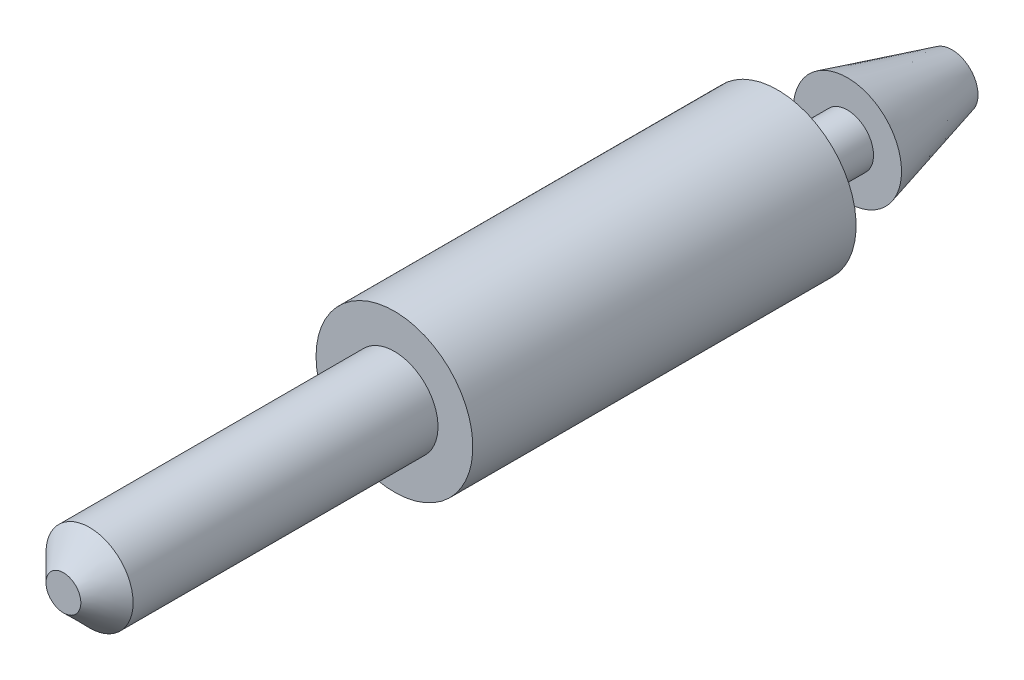
ISO-10303-21;
HEADER;
FILE_DESCRIPTION(('STEP AP214'),'2;1');
FILE_NAME('part.step','',(''),(''),'','','');
FILE_SCHEMA(('AUTOMOTIVE_DESIGN { 1 0 10303 214 1 1 1 1 }'));
ENDSEC;
DATA;
#1=APPLICATION_CONTEXT('core data for automotive mechanical design processes');
#2=APPLICATION_PROTOCOL_DEFINITION('international standard','automotive_design',2000,#1);
#3=PRODUCT_CONTEXT('',#1,'mechanical');
#4=PRODUCT('Part','Part','',(#3));
#5=PRODUCT_RELATED_PRODUCT_CATEGORY('part','',(#4));
#6=PRODUCT_DEFINITION_FORMATION('','',#4);
#7=PRODUCT_DEFINITION_CONTEXT('part definition',#1,'design');
#8=PRODUCT_DEFINITION('design','',#6,#7);
#9=PRODUCT_DEFINITION_SHAPE('','',#8);
#10=(LENGTH_UNIT() NAMED_UNIT(*) SI_UNIT(.MILLI.,.METRE.));
#11=(NAMED_UNIT(*) PLANE_ANGLE_UNIT() SI_UNIT($,.RADIAN.));
#12=(NAMED_UNIT(*) SI_UNIT($,.STERADIAN.) SOLID_ANGLE_UNIT());
#13=UNCERTAINTY_MEASURE_WITH_UNIT(LENGTH_MEASURE(1.E-05),#10,'distance_accuracy_value','');
#14=(GEOMETRIC_REPRESENTATION_CONTEXT(3) GLOBAL_UNCERTAINTY_ASSIGNED_CONTEXT((#13)) GLOBAL_UNIT_ASSIGNED_CONTEXT((#10,
#11,#12)) REPRESENTATION_CONTEXT('',''));
#15=CARTESIAN_POINT('',(0.,0.,0.));
#16=DIRECTION('',(0.,0.,1.));
#17=DIRECTION('',(1.,0.,0.));
#18=AXIS2_PLACEMENT_3D('',#15,#16,#17);
#19=CARTESIAN_POINT('',(0.,0.,0.));
#20=DIRECTION('',(0.,0.,1.));
#21=DIRECTION('',(-1.,0.,0.));
#22=AXIS2_PLACEMENT_3D('',#19,#20,#21);
#23=CONICAL_SURFACE('',#22,0.3,0.261799387799149);
#24=CARTESIAN_POINT('',(0.,0.,1.2));
#25=DIRECTION('',(0.,0.,-1.));
#26=DIRECTION('',(-1.,0.,0.));
#27=AXIS2_PLACEMENT_3D('',#24,#25,#26);
#28=CIRCLE('',#27,0.621539030917347);
#29=CARTESIAN_POINT('',(-0.621539030917347,0.,1.2));
#30=VERTEX_POINT('',#29);
#31=EDGE_CURVE('E10',#30,#30,#28,.T.);
#32=ORIENTED_EDGE('',*,*,#31,.T.);
#33=EDGE_LOOP('',(#32));
#34=FACE_BOUND('',#33,.T.);
#35=CARTESIAN_POINT('',(0.,0.,0.));
#36=DIRECTION('',(0.,0.,-1.));
#37=DIRECTION('',(-1.,0.,0.));
#38=AXIS2_PLACEMENT_3D('',#35,#36,#37);
#39=CIRCLE('',#38,0.3);
#40=CARTESIAN_POINT('',(-0.3,0.,0.));
#41=VERTEX_POINT('',#40);
#42=EDGE_CURVE('E31',#41,#41,#39,.T.);
#43=ORIENTED_EDGE('',*,*,#42,.F.);
#44=EDGE_LOOP('',(#43));
#45=FACE_BOUND('',#44,.T.);
#46=ADVANCED_FACE('F14',(#34,#45),#23,.T.);
#47=CARTESIAN_POINT('',(0.,0.,9.9));
#48=DIRECTION('',(0.,0.,-1.));
#49=DIRECTION('',(-1.,0.,0.));
#50=AXIS2_PLACEMENT_3D('',#47,#48,#49);
#51=CONICAL_SURFACE('',#50,0.499999999999999,0.785398163397451);
#52=CARTESIAN_POINT('',(0.,0.,9.9));
#53=DIRECTION('',(0.,0.,-1.));
#54=DIRECTION('',(1.,0.,0.));
#55=AXIS2_PLACEMENT_3D('',#52,#53,#54);
#56=CIRCLE('',#55,0.499999999999999);
#57=CARTESIAN_POINT('',(0.499999999999999,0.,9.9));
#58=VERTEX_POINT('',#57);
#59=EDGE_CURVE('E22',#58,#58,#56,.T.);
#60=ORIENTED_EDGE('',*,*,#59,.F.);
#61=EDGE_LOOP('',(#60));
#62=FACE_BOUND('',#61,.T.);
#63=CARTESIAN_POINT('',(0.,0.,10.2));
#64=DIRECTION('',(0.,0.,1.));
#65=DIRECTION('',(1.,0.,0.));
#66=AXIS2_PLACEMENT_3D('',#63,#64,#65);
#67=CIRCLE('',#66,0.199999999999994);
#68=CARTESIAN_POINT('',(0.199999999999994,0.,10.2));
#69=VERTEX_POINT('',#68);
#70=EDGE_CURVE('E32',#69,#69,#67,.T.);
#71=ORIENTED_EDGE('',*,*,#70,.F.);
#72=EDGE_LOOP('',(#71));
#73=FACE_BOUND('',#72,.T.);
#74=ADVANCED_FACE('F66',(#62,#73),#51,.T.);
#75=CARTESIAN_POINT('',(0.,0.,0.));
#76=DIRECTION('',(0.,0.,-1.));
#77=DIRECTION('',(-1.,0.,0.));
#78=AXIS2_PLACEMENT_3D('',#75,#76,#77);
#79=CYLINDRICAL_SURFACE('',#78,0.499999999999999);
#80=CARTESIAN_POINT('',(0.,0.,6.4));
#81=DIRECTION('',(0.,0.,-1.));
#82=DIRECTION('',(-1.,0.,0.));
#83=AXIS2_PLACEMENT_3D('',#80,#81,#82);
#84=CIRCLE('',#83,0.499999999999999);
#85=CARTESIAN_POINT('',(-0.499999999999999,0.,6.4));
#86=VERTEX_POINT('',#85);
#87=EDGE_CURVE('E34',#86,#86,#84,.T.);
#88=ORIENTED_EDGE('',*,*,#87,.F.);
#89=EDGE_LOOP('',(#88));
#90=FACE_BOUND('',#89,.T.);
#91=ORIENTED_EDGE('',*,*,#59,.T.);
#92=EDGE_LOOP('',(#91));
#93=FACE_BOUND('',#92,.T.);
#94=ADVANCED_FACE('F73',(#90,#93),#79,.T.);
#95=CARTESIAN_POINT('',(0.,0.,0.));
#96=DIRECTION('',(0.,0.,-1.));
#97=DIRECTION('',(-1.,0.,0.));
#98=AXIS2_PLACEMENT_3D('',#95,#96,#97);
#99=CYLINDRICAL_SURFACE('',#98,0.899999999999999);
#100=CARTESIAN_POINT('',(0.,0.,2.));
#101=DIRECTION('',(0.,0.,-1.));
#102=DIRECTION('',(-1.,0.,0.));
#103=AXIS2_PLACEMENT_3D('',#100,#101,#102);
#104=CIRCLE('',#103,0.9);
#105=CARTESIAN_POINT('',(-0.9,0.,2.));
#106=VERTEX_POINT('',#105);
#107=EDGE_CURVE('E38',#106,#106,#104,.T.);
#108=ORIENTED_EDGE('',*,*,#107,.F.);
#109=EDGE_LOOP('',(#108));
#110=FACE_BOUND('',#109,.T.);
#111=CARTESIAN_POINT('',(0.,0.,6.4));
#112=DIRECTION('',(0.,0.,-1.));
#113=DIRECTION('',(-1.,0.,0.));
#114=AXIS2_PLACEMENT_3D('',#111,#112,#113);
#115=CIRCLE('',#114,0.899999999999999);
#116=CARTESIAN_POINT('',(-0.899999999999999,0.,6.4));
#117=VERTEX_POINT('',#116);
#118=EDGE_CURVE('E27',#117,#117,#115,.T.);
#119=ORIENTED_EDGE('',*,*,#118,.T.);
#120=EDGE_LOOP('',(#119));
#121=FACE_BOUND('',#120,.T.);
#122=ADVANCED_FACE('F80',(#110,#121),#99,.T.);
#123=CARTESIAN_POINT('',(0.,0.,0.));
#124=DIRECTION('',(0.,0.,-1.));
#125=DIRECTION('',(-1.,0.,0.));
#126=AXIS2_PLACEMENT_3D('',#123,#124,#125);
#127=CYLINDRICAL_SURFACE('',#126,0.3);
#128=CARTESIAN_POINT('',(0.,0.,1.2));
#129=DIRECTION('',(0.,0.,1.));
#130=DIRECTION('',(-1.,0.,0.));
#131=AXIS2_PLACEMENT_3D('',#128,#129,#130);
#132=CIRCLE('',#131,0.3);
#133=CARTESIAN_POINT('',(-0.3,0.,1.2));
#134=VERTEX_POINT('',#133);
#135=EDGE_CURVE('E18',#134,#134,#132,.T.);
#136=ORIENTED_EDGE('',*,*,#135,.T.);
#137=EDGE_LOOP('',(#136));
#138=FACE_BOUND('',#137,.T.);
#139=CARTESIAN_POINT('',(0.,0.,2.));
#140=DIRECTION('',(0.,0.,-1.));
#141=DIRECTION('',(-1.,0.,0.));
#142=AXIS2_PLACEMENT_3D('',#139,#140,#141);
#143=CIRCLE('',#142,0.3);
#144=CARTESIAN_POINT('',(-0.3,0.,2.));
#145=VERTEX_POINT('',#144);
#146=EDGE_CURVE('E41',#145,#145,#143,.T.);
#147=ORIENTED_EDGE('',*,*,#146,.T.);
#148=EDGE_LOOP('',(#147));
#149=FACE_BOUND('',#148,.T.);
#150=ADVANCED_FACE('F49',(#138,#149),#127,.T.);
#151=CARTESIAN_POINT('',(0.,0.3,2.));
#152=DIRECTION('',(0.,0.,-1.));
#153=DIRECTION('',(-1.,0.,0.));
#154=AXIS2_PLACEMENT_3D('',#151,#152,#153);
#155=PLANE('',#154);
#156=ORIENTED_EDGE('',*,*,#107,.T.);
#157=EDGE_LOOP('',(#156));
#158=FACE_BOUND('',#157,.T.);
#159=ORIENTED_EDGE('',*,*,#146,.F.);
#160=EDGE_LOOP('',(#159));
#161=FACE_BOUND('',#160,.T.);
#162=ADVANCED_FACE('F87',(#158,#161),#155,.T.);
#163=CARTESIAN_POINT('',(0.,0.899999999999999,6.4));
#164=DIRECTION('',(0.,0.,1.));
#165=DIRECTION('',(1.,0.,0.));
#166=AXIS2_PLACEMENT_3D('',#163,#164,#165);
#167=PLANE('',#166);
#168=ORIENTED_EDGE('',*,*,#87,.T.);
#169=EDGE_LOOP('',(#168));
#170=FACE_BOUND('',#169,.T.);
#171=ORIENTED_EDGE('',*,*,#118,.F.);
#172=EDGE_LOOP('',(#171));
#173=FACE_BOUND('',#172,.T.);
#174=ADVANCED_FACE('F62',(#170,#173),#167,.T.);
#175=CARTESIAN_POINT('',(0.,0.499999999999999,10.2));
#176=DIRECTION('',(0.,0.,1.));
#177=DIRECTION('',(1.,0.,0.));
#178=AXIS2_PLACEMENT_3D('',#175,#176,#177);
#179=PLANE('',#178);
#180=ORIENTED_EDGE('',*,*,#70,.T.);
#181=EDGE_LOOP('',(#180));
#182=FACE_BOUND('',#181,.T.);
#183=ADVANCED_FACE('F54',(#182),#179,.T.);
#184=CARTESIAN_POINT('',(0.,0.,1.2));
#185=DIRECTION('',(0.,0.,-1.));
#186=DIRECTION('',(-1.,0.,0.));
#187=AXIS2_PLACEMENT_3D('',#184,#185,#186);
#188=PLANE('',#187);
#189=ORIENTED_EDGE('',*,*,#135,.F.);
#190=EDGE_LOOP('',(#189));
#191=FACE_BOUND('',#190,.T.);
#192=ORIENTED_EDGE('',*,*,#31,.F.);
#193=EDGE_LOOP('',(#192));
#194=FACE_BOUND('',#193,.T.);
#195=ADVANCED_FACE('F51',(#191,#194),#188,.F.);
#196=CARTESIAN_POINT('',(0.,0.,0.));
#197=DIRECTION('',(0.,0.,-1.));
#198=DIRECTION('',(-1.,0.,0.));
#199=AXIS2_PLACEMENT_3D('',#196,#197,#198);
#200=PLANE('',#199);
#201=ORIENTED_EDGE('',*,*,#42,.T.);
#202=EDGE_LOOP('',(#201));
#203=FACE_BOUND('',#202,.T.);
#204=ADVANCED_FACE('F16',(#203),#200,.T.);
#205=CLOSED_SHELL('',(#46,#74,#94,#122,#150,#162,#174,#183,#195,#204));
#206=MANIFOLD_SOLID_BREP('B1',#205);
#207=ADVANCED_BREP_SHAPE_REPRESENTATION('',(#18,#206),#14);
#208=SHAPE_DEFINITION_REPRESENTATION(#9,#207);
ENDSEC;
END-ISO-10303-21;
